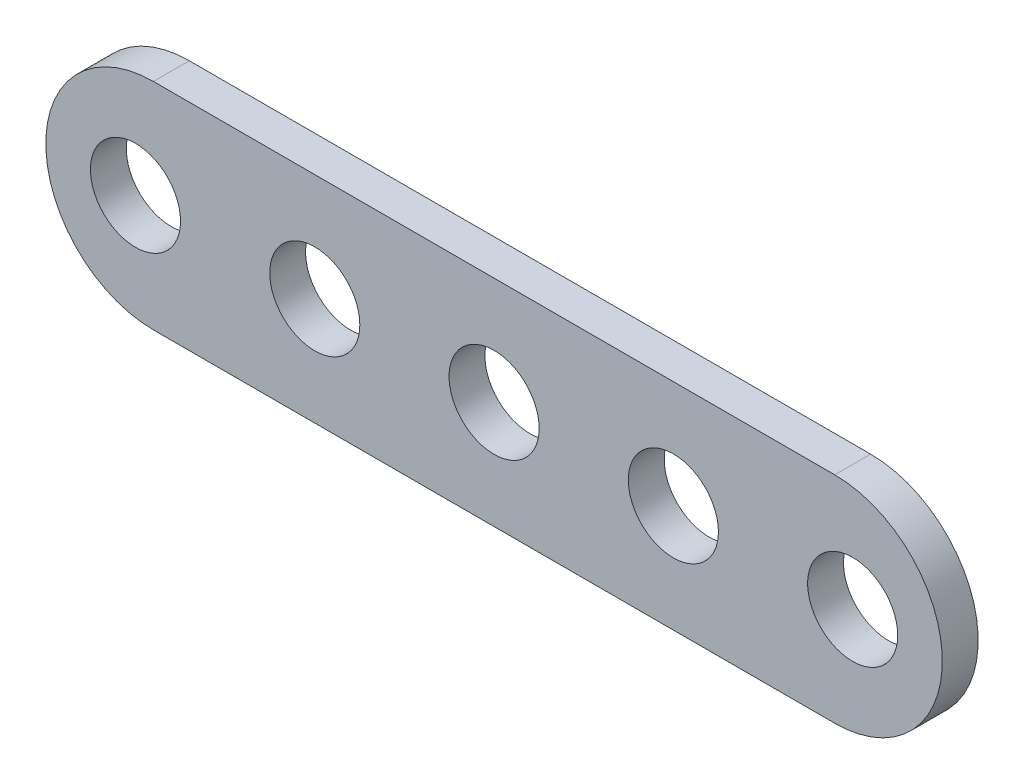
ISO-10303-21;
HEADER;
FILE_DESCRIPTION(('STEP AP214'),'2;1');
FILE_NAME('part.step','',(''),(''),'','','');
FILE_SCHEMA(('AUTOMOTIVE_DESIGN { 1 0 10303 214 1 1 1 1 }'));
ENDSEC;
DATA;
#1=APPLICATION_CONTEXT('core data for automotive mechanical design processes');
#2=APPLICATION_PROTOCOL_DEFINITION('international standard','automotive_design',2000,#1);
#3=PRODUCT_CONTEXT('',#1,'mechanical');
#4=PRODUCT('Part','Part','',(#3));
#5=PRODUCT_RELATED_PRODUCT_CATEGORY('part','',(#4));
#6=PRODUCT_DEFINITION_FORMATION('','',#4);
#7=PRODUCT_DEFINITION_CONTEXT('part definition',#1,'design');
#8=PRODUCT_DEFINITION('design','',#6,#7);
#9=PRODUCT_DEFINITION_SHAPE('','',#8);
#10=(LENGTH_UNIT() NAMED_UNIT(*) SI_UNIT(.MILLI.,.METRE.));
#11=(NAMED_UNIT(*) PLANE_ANGLE_UNIT() SI_UNIT($,.RADIAN.));
#12=(NAMED_UNIT(*) SI_UNIT($,.STERADIAN.) SOLID_ANGLE_UNIT());
#13=UNCERTAINTY_MEASURE_WITH_UNIT(LENGTH_MEASURE(1.E-05),#10,'distance_accuracy_value','');
#14=(GEOMETRIC_REPRESENTATION_CONTEXT(3) GLOBAL_UNCERTAINTY_ASSIGNED_CONTEXT((#13)) GLOBAL_UNIT_ASSIGNED_CONTEXT((#10,
#11,#12)) REPRESENTATION_CONTEXT('',''));
#15=CARTESIAN_POINT('',(0.,0.,0.));
#16=DIRECTION('',(0.,0.,1.));
#17=DIRECTION('',(1.,0.,0.));
#18=AXIS2_PLACEMENT_3D('',#15,#16,#17);
#19=CARTESIAN_POINT('',(-62.4522646350927,0.,-1.6));
#20=DIRECTION('',(0.,0.,1.));
#21=DIRECTION('',(1.,0.,0.));
#22=AXIS2_PLACEMENT_3D('',#19,#20,#21);
#23=PLANE('',#22);
#24=CARTESIAN_POINT('',(-50.4522646350927,4.8,-1.6));
#25=DIRECTION('',(0.,0.,1.));
#26=DIRECTION('',(1.,0.,0.));
#27=AXIS2_PLACEMENT_3D('',#24,#25,#26);
#28=CIRCLE('',#27,2.01);
#29=CARTESIAN_POINT('',(-48.4422646350927,4.8,-1.6));
#30=VERTEX_POINT('',#29);
#31=EDGE_CURVE('E101',#30,#30,#28,.T.);
#32=ORIENTED_EDGE('',*,*,#31,.T.);
#33=EDGE_LOOP('',(#32));
#34=FACE_BOUND('',#33,.T.);
#35=CARTESIAN_POINT('',(-58.4522646350927,4.8,-1.6));
#36=DIRECTION('',(0.,0.,1.));
#37=DIRECTION('',(1.,0.,0.));
#38=AXIS2_PLACEMENT_3D('',#35,#36,#37);
#39=CIRCLE('',#38,2.01);
#40=CARTESIAN_POINT('',(-56.4422646350927,4.8,-1.6));
#41=VERTEX_POINT('',#40);
#42=EDGE_CURVE('E104',#41,#41,#39,.T.);
#43=ORIENTED_EDGE('',*,*,#42,.T.);
#44=EDGE_LOOP('',(#43));
#45=FACE_BOUND('',#44,.T.);
#46=DIRECTION('',(1.,0.,0.));
#47=VECTOR('',#46,1.);
#48=CARTESIAN_POINT('',(-62.4522646350927,0.,-1.6));
#49=LINE('',#48,#47);
#50=CARTESIAN_POINT('',(-57.6522646350927,0.,-1.6));
#51=VERTEX_POINT('',#50);
#52=CARTESIAN_POINT('',(-27.2522646350927,0.,-1.6));
#53=VERTEX_POINT('',#52);
#54=EDGE_CURVE('E68',#51,#53,#49,.T.);
#55=ORIENTED_EDGE('',*,*,#54,.F.);
#56=CARTESIAN_POINT('',(-57.6522646350927,4.8,-1.6));
#57=DIRECTION('',(0.,0.,1.));
#58=DIRECTION('',(1.,0.,0.));
#59=AXIS2_PLACEMENT_3D('',#56,#57,#58);
#60=CIRCLE('',#59,4.8);
#61=CARTESIAN_POINT('',(-57.6522646350927,9.6,-1.6));
#62=VERTEX_POINT('',#61);
#63=EDGE_CURVE('E59',#62,#51,#60,.T.);
#64=ORIENTED_EDGE('',*,*,#63,.F.);
#65=DIRECTION('',(1.,0.,0.));
#66=VECTOR('',#65,1.);
#67=CARTESIAN_POINT('',(-62.4522646350927,9.6,-1.6));
#68=LINE('',#67,#66);
#69=CARTESIAN_POINT('',(-27.2522646350927,9.6,-1.6));
#70=VERTEX_POINT('',#69);
#71=EDGE_CURVE('E54',#70,#62,#68,.F.);
#72=ORIENTED_EDGE('',*,*,#71,.F.);
#73=CARTESIAN_POINT('',(-27.2522646350927,4.8,-1.6));
#74=DIRECTION('',(0.,0.,1.));
#75=DIRECTION('',(1.,0.,0.));
#76=AXIS2_PLACEMENT_3D('',#73,#74,#75);
#77=CIRCLE('',#76,4.8);
#78=EDGE_CURVE('E71',#53,#70,#77,.T.);
#79=ORIENTED_EDGE('',*,*,#78,.F.);
#80=EDGE_LOOP('',(#55,#64,#72,#79));
#81=FACE_BOUND('',#80,.T.);
#82=CARTESIAN_POINT('',(-42.4522646350927,4.8,-1.6));
#83=DIRECTION('',(0.,0.,1.));
#84=DIRECTION('',(1.,0.,0.));
#85=AXIS2_PLACEMENT_3D('',#82,#83,#84);
#86=CIRCLE('',#85,2.01);
#87=CARTESIAN_POINT('',(-40.4422646350927,4.8,-1.6));
#88=VERTEX_POINT('',#87);
#89=EDGE_CURVE('E82',#88,#88,#86,.T.);
#90=ORIENTED_EDGE('',*,*,#89,.T.);
#91=EDGE_LOOP('',(#90));
#92=FACE_BOUND('',#91,.T.);
#93=CARTESIAN_POINT('',(-34.4522646350927,4.8,-1.6));
#94=DIRECTION('',(0.,0.,1.));
#95=DIRECTION('',(1.,0.,0.));
#96=AXIS2_PLACEMENT_3D('',#93,#94,#95);
#97=CIRCLE('',#96,2.01);
#98=CARTESIAN_POINT('',(-32.4422646350927,4.8,-1.6));
#99=VERTEX_POINT('',#98);
#100=EDGE_CURVE('E110',#99,#99,#97,.T.);
#101=ORIENTED_EDGE('',*,*,#100,.T.);
#102=EDGE_LOOP('',(#101));
#103=FACE_BOUND('',#102,.T.);
#104=CARTESIAN_POINT('',(-26.4522646350927,4.8,-1.6));
#105=DIRECTION('',(0.,0.,1.));
#106=DIRECTION('',(1.,0.,0.));
#107=AXIS2_PLACEMENT_3D('',#104,#105,#106);
#108=CIRCLE('',#107,2.01);
#109=CARTESIAN_POINT('',(-24.4422646350927,4.8,-1.6));
#110=VERTEX_POINT('',#109);
#111=EDGE_CURVE('E20',#110,#110,#108,.T.);
#112=ORIENTED_EDGE('',*,*,#111,.T.);
#113=EDGE_LOOP('',(#112));
#114=FACE_BOUND('',#113,.T.);
#115=ADVANCED_FACE('F17',(#34,#45,#81,#92,#103,#114),#23,.F.);
#116=CARTESIAN_POINT('',(-26.4522646350927,4.8,-10.));
#117=DIRECTION('',(0.,0.,1.));
#118=DIRECTION('',(1.,0.,0.));
#119=AXIS2_PLACEMENT_3D('',#116,#117,#118);
#120=CYLINDRICAL_SURFACE('',#119,2.01);
#121=ORIENTED_EDGE('',*,*,#111,.F.);
#122=EDGE_LOOP('',(#121));
#123=FACE_BOUND('',#122,.T.);
#124=CARTESIAN_POINT('',(-26.4522646350927,4.8,0.));
#125=DIRECTION('',(0.,0.,1.));
#126=DIRECTION('',(1.,0.,0.));
#127=AXIS2_PLACEMENT_3D('',#124,#125,#126);
#128=CIRCLE('',#127,2.01);
#129=CARTESIAN_POINT('',(-24.4422646350927,4.8,0.));
#130=VERTEX_POINT('',#129);
#131=EDGE_CURVE('E98',#130,#130,#128,.F.);
#132=ORIENTED_EDGE('',*,*,#131,.F.);
#133=EDGE_LOOP('',(#132));
#134=FACE_BOUND('',#133,.T.);
#135=ADVANCED_FACE('F118',(#123,#134),#120,.F.);
#136=CARTESIAN_POINT('',(-34.4522646350927,4.8,-10.));
#137=DIRECTION('',(0.,0.,1.));
#138=DIRECTION('',(1.,0.,0.));
#139=AXIS2_PLACEMENT_3D('',#136,#137,#138);
#140=CYLINDRICAL_SURFACE('',#139,2.01);
#141=ORIENTED_EDGE('',*,*,#100,.F.);
#142=EDGE_LOOP('',(#141));
#143=FACE_BOUND('',#142,.T.);
#144=CARTESIAN_POINT('',(-34.4522646350927,4.8,0.));
#145=DIRECTION('',(0.,0.,1.));
#146=DIRECTION('',(1.,0.,0.));
#147=AXIS2_PLACEMENT_3D('',#144,#145,#146);
#148=CIRCLE('',#147,2.01);
#149=CARTESIAN_POINT('',(-32.4422646350927,4.8,0.));
#150=VERTEX_POINT('',#149);
#151=EDGE_CURVE('E95',#150,#150,#148,.F.);
#152=ORIENTED_EDGE('',*,*,#151,.F.);
#153=EDGE_LOOP('',(#152));
#154=FACE_BOUND('',#153,.T.);
#155=ADVANCED_FACE('F121',(#143,#154),#140,.F.);
#156=CARTESIAN_POINT('',(-42.4522646350927,4.8,-10.));
#157=DIRECTION('',(0.,0.,1.));
#158=DIRECTION('',(1.,0.,0.));
#159=AXIS2_PLACEMENT_3D('',#156,#157,#158);
#160=CYLINDRICAL_SURFACE('',#159,2.01);
#161=ORIENTED_EDGE('',*,*,#89,.F.);
#162=EDGE_LOOP('',(#161));
#163=FACE_BOUND('',#162,.T.);
#164=CARTESIAN_POINT('',(-42.4522646350927,4.8,0.));
#165=DIRECTION('',(0.,0.,1.));
#166=DIRECTION('',(1.,0.,0.));
#167=AXIS2_PLACEMENT_3D('',#164,#165,#166);
#168=CIRCLE('',#167,2.01);
#169=CARTESIAN_POINT('',(-40.4422646350927,4.8,0.));
#170=VERTEX_POINT('',#169);
#171=EDGE_CURVE('E92',#170,#170,#168,.F.);
#172=ORIENTED_EDGE('',*,*,#171,.F.);
#173=EDGE_LOOP('',(#172));
#174=FACE_BOUND('',#173,.T.);
#175=ADVANCED_FACE('F152',(#163,#174),#160,.F.);
#176=CARTESIAN_POINT('',(-62.4522646350927,9.6,-1.6));
#177=DIRECTION('',(0.,1.,0.));
#178=DIRECTION('',(0.,0.,1.));
#179=AXIS2_PLACEMENT_3D('',#176,#177,#178);
#180=PLANE('',#179);
#181=DIRECTION('',(1.,0.,0.));
#182=VECTOR('',#181,1.);
#183=CARTESIAN_POINT('',(-62.4522646350927,9.6,0.));
#184=LINE('',#183,#182);
#185=CARTESIAN_POINT('',(-27.2522646350927,9.6,0.));
#186=VERTEX_POINT('',#185);
#187=CARTESIAN_POINT('',(-57.6522646350927,9.6,0.));
#188=VERTEX_POINT('',#187);
#189=EDGE_CURVE('E91',#186,#188,#184,.F.);
#190=ORIENTED_EDGE('',*,*,#189,.F.);
#191=DIRECTION('',(0.,0.,1.));
#192=VECTOR('',#191,1.);
#193=CARTESIAN_POINT('',(-27.2522646350927,9.6,-1.6));
#194=LINE('',#193,#192);
#195=EDGE_CURVE('E107',#70,#186,#194,.T.);
#196=ORIENTED_EDGE('',*,*,#195,.F.);
#197=ORIENTED_EDGE('',*,*,#71,.T.);
#198=DIRECTION('',(0.,0.,1.));
#199=VECTOR('',#198,1.);
#200=CARTESIAN_POINT('',(-57.6522646350927,9.6,-1.6));
#201=LINE('',#200,#199);
#202=EDGE_CURVE('E65',#188,#62,#201,.F.);
#203=ORIENTED_EDGE('',*,*,#202,.F.);
#204=EDGE_LOOP('',(#190,#196,#197,#203));
#205=FACE_BOUND('',#204,.T.);
#206=ADVANCED_FACE('F149',(#205),#180,.T.);
#207=CARTESIAN_POINT('',(-57.6522646350927,4.8,-1.6));
#208=DIRECTION('',(0.,0.,1.));
#209=DIRECTION('',(1.,0.,0.));
#210=AXIS2_PLACEMENT_3D('',#207,#208,#209);
#211=CYLINDRICAL_SURFACE('',#210,4.8);
#212=ORIENTED_EDGE('',*,*,#63,.T.);
#213=DIRECTION('',(0.,0.,-1.));
#214=VECTOR('',#213,1.);
#215=CARTESIAN_POINT('',(-57.6522646350927,0.,-1.6));
#216=LINE('',#215,#214);
#217=CARTESIAN_POINT('',(-57.6522646350927,0.,0.));
#218=VERTEX_POINT('',#217);
#219=EDGE_CURVE('E64',#218,#51,#216,.T.);
#220=ORIENTED_EDGE('',*,*,#219,.F.);
#221=CARTESIAN_POINT('',(-57.6522646350927,4.8,0.));
#222=DIRECTION('',(0.,0.,1.));
#223=DIRECTION('',(1.,0.,0.));
#224=AXIS2_PLACEMENT_3D('',#221,#222,#223);
#225=CIRCLE('',#224,4.8);
#226=EDGE_CURVE('E89',#188,#218,#225,.T.);
#227=ORIENTED_EDGE('',*,*,#226,.F.);
#228=ORIENTED_EDGE('',*,*,#202,.T.);
#229=EDGE_LOOP('',(#212,#220,#227,#228));
#230=FACE_BOUND('',#229,.T.);
#231=ADVANCED_FACE('F61',(#230),#211,.T.);
#232=CARTESIAN_POINT('',(-62.4522646350927,0.,-1.6));
#233=DIRECTION('',(0.,-1.,0.));
#234=DIRECTION('',(0.,0.,-1.));
#235=AXIS2_PLACEMENT_3D('',#232,#233,#234);
#236=PLANE('',#235);
#237=ORIENTED_EDGE('',*,*,#54,.T.);
#238=DIRECTION('',(0.,0.,1.));
#239=VECTOR('',#238,1.);
#240=CARTESIAN_POINT('',(-27.2522646350927,0.,-1.6));
#241=LINE('',#240,#239);
#242=CARTESIAN_POINT('',(-27.2522646350927,0.,0.));
#243=VERTEX_POINT('',#242);
#244=EDGE_CURVE('E35',#243,#53,#241,.F.);
#245=ORIENTED_EDGE('',*,*,#244,.F.);
#246=DIRECTION('',(1.,0.,0.));
#247=VECTOR('',#246,1.);
#248=CARTESIAN_POINT('',(-62.4522646350927,0.,0.));
#249=LINE('',#248,#247);
#250=EDGE_CURVE('E75',#218,#243,#249,.T.);
#251=ORIENTED_EDGE('',*,*,#250,.F.);
#252=ORIENTED_EDGE('',*,*,#219,.T.);
#253=EDGE_LOOP('',(#237,#245,#251,#252));
#254=FACE_BOUND('',#253,.T.);
#255=ADVANCED_FACE('F73',(#254),#236,.T.);
#256=CARTESIAN_POINT('',(-27.2522646350927,4.8,-1.6));
#257=DIRECTION('',(0.,0.,1.));
#258=DIRECTION('',(1.,0.,0.));
#259=AXIS2_PLACEMENT_3D('',#256,#257,#258);
#260=CYLINDRICAL_SURFACE('',#259,4.8);
#261=ORIENTED_EDGE('',*,*,#195,.T.);
#262=CARTESIAN_POINT('',(-27.2522646350927,4.8,0.));
#263=DIRECTION('',(0.,0.,1.));
#264=DIRECTION('',(1.,0.,0.));
#265=AXIS2_PLACEMENT_3D('',#262,#263,#264);
#266=CIRCLE('',#265,4.8);
#267=EDGE_CURVE('E86',#243,#186,#266,.T.);
#268=ORIENTED_EDGE('',*,*,#267,.F.);
#269=ORIENTED_EDGE('',*,*,#244,.T.);
#270=ORIENTED_EDGE('',*,*,#78,.T.);
#271=EDGE_LOOP('',(#261,#268,#269,#270));
#272=FACE_BOUND('',#271,.T.);
#273=ADVANCED_FACE('F140',(#272),#260,.T.);
#274=CARTESIAN_POINT('',(-58.4522646350927,4.8,-10.));
#275=DIRECTION('',(0.,0.,1.));
#276=DIRECTION('',(1.,0.,0.));
#277=AXIS2_PLACEMENT_3D('',#274,#275,#276);
#278=CYLINDRICAL_SURFACE('',#277,2.01);
#279=ORIENTED_EDGE('',*,*,#42,.F.);
#280=EDGE_LOOP('',(#279));
#281=FACE_BOUND('',#280,.T.);
#282=CARTESIAN_POINT('',(-58.4522646350927,4.8,0.));
#283=DIRECTION('',(0.,0.,1.));
#284=DIRECTION('',(1.,0.,0.));
#285=AXIS2_PLACEMENT_3D('',#282,#283,#284);
#286=CIRCLE('',#285,2.01);
#287=CARTESIAN_POINT('',(-56.4422646350927,4.8,0.));
#288=VERTEX_POINT('',#287);
#289=EDGE_CURVE('E26',#288,#288,#286,.F.);
#290=ORIENTED_EDGE('',*,*,#289,.F.);
#291=EDGE_LOOP('',(#290));
#292=FACE_BOUND('',#291,.T.);
#293=ADVANCED_FACE('F133',(#281,#292),#278,.F.);
#294=CARTESIAN_POINT('',(-50.4522646350927,4.8,-10.));
#295=DIRECTION('',(0.,0.,1.));
#296=DIRECTION('',(1.,0.,0.));
#297=AXIS2_PLACEMENT_3D('',#294,#295,#296);
#298=CYLINDRICAL_SURFACE('',#297,2.01);
#299=ORIENTED_EDGE('',*,*,#31,.F.);
#300=EDGE_LOOP('',(#299));
#301=FACE_BOUND('',#300,.T.);
#302=CARTESIAN_POINT('',(-50.4522646350927,4.8,0.));
#303=DIRECTION('',(0.,0.,1.));
#304=DIRECTION('',(1.,0.,0.));
#305=AXIS2_PLACEMENT_3D('',#302,#303,#304);
#306=CIRCLE('',#305,2.01);
#307=CARTESIAN_POINT('',(-48.4422646350927,4.8,0.));
#308=VERTEX_POINT('',#307);
#309=EDGE_CURVE('E10',#308,#308,#306,.F.);
#310=ORIENTED_EDGE('',*,*,#309,.F.);
#311=EDGE_LOOP('',(#310));
#312=FACE_BOUND('',#311,.T.);
#313=ADVANCED_FACE('F126',(#301,#312),#298,.F.);
#314=CARTESIAN_POINT('',(-62.4522646350927,0.,0.));
#315=DIRECTION('',(0.,0.,1.));
#316=DIRECTION('',(1.,0.,0.));
#317=AXIS2_PLACEMENT_3D('',#314,#315,#316);
#318=PLANE('',#317);
#319=ORIENTED_EDGE('',*,*,#309,.T.);
#320=EDGE_LOOP('',(#319));
#321=FACE_BOUND('',#320,.T.);
#322=ORIENTED_EDGE('',*,*,#289,.T.);
#323=EDGE_LOOP('',(#322));
#324=FACE_BOUND('',#323,.T.);
#325=ORIENTED_EDGE('',*,*,#267,.T.);
#326=ORIENTED_EDGE('',*,*,#189,.T.);
#327=ORIENTED_EDGE('',*,*,#226,.T.);
#328=ORIENTED_EDGE('',*,*,#250,.T.);
#329=EDGE_LOOP('',(#325,#326,#327,#328));
#330=FACE_BOUND('',#329,.T.);
#331=ORIENTED_EDGE('',*,*,#171,.T.);
#332=EDGE_LOOP('',(#331));
#333=FACE_BOUND('',#332,.T.);
#334=ORIENTED_EDGE('',*,*,#151,.T.);
#335=EDGE_LOOP('',(#334));
#336=FACE_BOUND('',#335,.T.);
#337=ORIENTED_EDGE('',*,*,#131,.T.);
#338=EDGE_LOOP('',(#337));
#339=FACE_BOUND('',#338,.T.);
#340=ADVANCED_FACE('F124',(#321,#324,#330,#333,#336,#339),#318,.T.);
#341=CLOSED_SHELL('',(#115,#135,#155,#175,#206,#231,#255,#273,#293,#313,#340));
#342=MANIFOLD_SOLID_BREP('B1',#341);
#343=ADVANCED_BREP_SHAPE_REPRESENTATION('',(#18,#342),#14);
#344=SHAPE_DEFINITION_REPRESENTATION(#9,#343);
ENDSEC;
END-ISO-10303-21;
